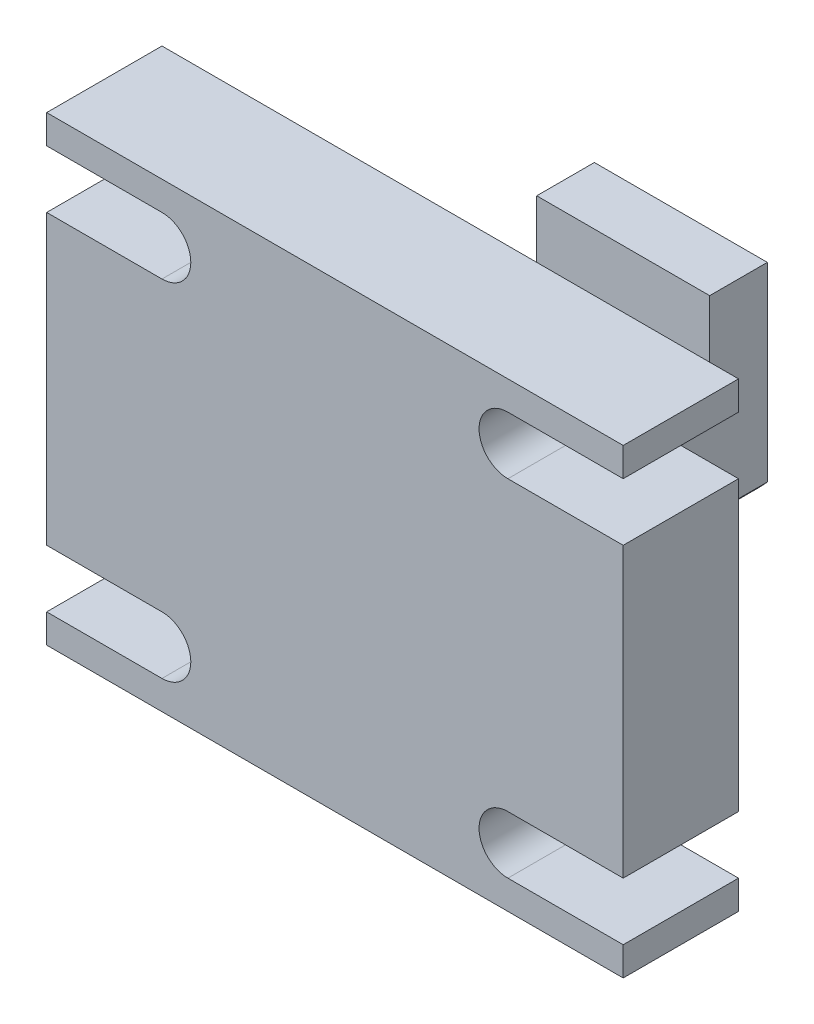
ISO-10303-21;
HEADER;
FILE_DESCRIPTION(('STEP AP214'),'2;1');
FILE_NAME('part.step','',(''),(''),'','','');
FILE_SCHEMA(('AUTOMOTIVE_DESIGN { 1 0 10303 214 1 1 1 1 }'));
ENDSEC;
DATA;
#1=APPLICATION_CONTEXT('core data for automotive mechanical design processes');
#2=APPLICATION_PROTOCOL_DEFINITION('international standard','automotive_design',2000,#1);
#3=PRODUCT_CONTEXT('',#1,'mechanical');
#4=PRODUCT('Part','Part','',(#3));
#5=PRODUCT_RELATED_PRODUCT_CATEGORY('part','',(#4));
#6=PRODUCT_DEFINITION_FORMATION('','',#4);
#7=PRODUCT_DEFINITION_CONTEXT('part definition',#1,'design');
#8=PRODUCT_DEFINITION('design','',#6,#7);
#9=PRODUCT_DEFINITION_SHAPE('','',#8);
#10=(LENGTH_UNIT() NAMED_UNIT(*) SI_UNIT(.MILLI.,.METRE.));
#11=(NAMED_UNIT(*) PLANE_ANGLE_UNIT() SI_UNIT($,.RADIAN.));
#12=(NAMED_UNIT(*) SI_UNIT($,.STERADIAN.) SOLID_ANGLE_UNIT());
#13=UNCERTAINTY_MEASURE_WITH_UNIT(LENGTH_MEASURE(1.E-05),#10,'distance_accuracy_value','');
#14=(GEOMETRIC_REPRESENTATION_CONTEXT(3) GLOBAL_UNCERTAINTY_ASSIGNED_CONTEXT((#13)) GLOBAL_UNIT_ASSIGNED_CONTEXT((#10,
#11,#12)) REPRESENTATION_CONTEXT('',''));
#15=CARTESIAN_POINT('',(0.,0.,0.));
#16=DIRECTION('',(0.,0.,1.));
#17=DIRECTION('',(1.,0.,0.));
#18=AXIS2_PLACEMENT_3D('',#15,#16,#17);
#19=CARTESIAN_POINT('',(0.,0.,0.));
#20=DIRECTION('',(0.,0.,1.));
#21=DIRECTION('',(1.,0.,0.));
#22=AXIS2_PLACEMENT_3D('',#19,#20,#21);
#23=PLANE('',#22);
#24=CARTESIAN_POINT('',(-30.,-30.,0.));
#25=DIRECTION('',(0.,0.,1.));
#26=DIRECTION('',(1.,0.,0.));
#27=AXIS2_PLACEMENT_3D('',#24,#25,#26);
#28=CIRCLE('',#27,5.);
#29=CARTESIAN_POINT('',(-30.,-35.,0.));
#30=VERTEX_POINT('',#29);
#31=CARTESIAN_POINT('',(-30.,-25.,0.));
#32=VERTEX_POINT('',#31);
#33=EDGE_CURVE('E213',#30,#32,#28,.T.);
#34=ORIENTED_EDGE('',*,*,#33,.T.);
#35=DIRECTION('',(1.,0.,0.));
#36=VECTOR('',#35,1.);
#37=CARTESIAN_POINT('',(0.,-25.,0.));
#38=LINE('',#37,#36);
#39=CARTESIAN_POINT('',(-50.,-25.,0.));
#40=VERTEX_POINT('',#39);
#41=EDGE_CURVE('E260',#40,#32,#38,.T.);
#42=ORIENTED_EDGE('',*,*,#41,.F.);
#43=DIRECTION('',(0.,-1.,0.));
#44=VECTOR('',#43,1.);
#45=CARTESIAN_POINT('',(-50.,0.,0.));
#46=LINE('',#45,#44);
#47=CARTESIAN_POINT('',(-50.,25.,0.));
#48=VERTEX_POINT('',#47);
#49=EDGE_CURVE('E223',#48,#40,#46,.T.);
#50=ORIENTED_EDGE('',*,*,#49,.F.);
#51=DIRECTION('',(1.,0.,0.));
#52=VECTOR('',#51,1.);
#53=CARTESIAN_POINT('',(0.,25.,0.));
#54=LINE('',#53,#52);
#55=CARTESIAN_POINT('',(-30.,25.,0.));
#56=VERTEX_POINT('',#55);
#57=EDGE_CURVE('E190',#48,#56,#54,.T.);
#58=ORIENTED_EDGE('',*,*,#57,.T.);
#59=CARTESIAN_POINT('',(-30.,30.,0.));
#60=DIRECTION('',(0.,0.,1.));
#61=DIRECTION('',(1.,0.,0.));
#62=AXIS2_PLACEMENT_3D('',#59,#60,#61);
#63=CIRCLE('',#62,5.);
#64=CARTESIAN_POINT('',(-30.,35.,0.));
#65=VERTEX_POINT('',#64);
#66=EDGE_CURVE('E256',#56,#65,#63,.T.);
#67=ORIENTED_EDGE('',*,*,#66,.T.);
#68=DIRECTION('',(1.,0.,0.));
#69=VECTOR('',#68,1.);
#70=CARTESIAN_POINT('',(0.,35.,0.));
#71=LINE('',#70,#69);
#72=CARTESIAN_POINT('',(-50.,35.,0.));
#73=VERTEX_POINT('',#72);
#74=EDGE_CURVE('E253',#73,#65,#71,.T.);
#75=ORIENTED_EDGE('',*,*,#74,.F.);
#76=CARTESIAN_POINT('',(-50.,40.,0.));
#77=VERTEX_POINT('',#76);
#78=EDGE_CURVE('E224',#77,#73,#46,.T.);
#79=ORIENTED_EDGE('',*,*,#78,.F.);
#80=DIRECTION('',(1.,0.,0.));
#81=VECTOR('',#80,1.);
#82=CARTESIAN_POINT('',(0.,40.,0.));
#83=LINE('',#82,#81);
#84=CARTESIAN_POINT('',(50.,40.,0.));
#85=VERTEX_POINT('',#84);
#86=EDGE_CURVE('E250',#77,#85,#83,.T.);
#87=ORIENTED_EDGE('',*,*,#86,.T.);
#88=DIRECTION('',(0.,-1.,0.));
#89=VECTOR('',#88,1.);
#90=CARTESIAN_POINT('',(50.,0.,0.));
#91=LINE('',#90,#89);
#92=CARTESIAN_POINT('',(50.,35.,0.));
#93=VERTEX_POINT('',#92);
#94=EDGE_CURVE('E231',#85,#93,#91,.T.);
#95=ORIENTED_EDGE('',*,*,#94,.T.);
#96=DIRECTION('',(-1.,0.,0.));
#97=VECTOR('',#96,1.);
#98=CARTESIAN_POINT('',(0.,35.,0.));
#99=LINE('',#98,#97);
#100=CARTESIAN_POINT('',(30.,35.,0.));
#101=VERTEX_POINT('',#100);
#102=EDGE_CURVE('E247',#93,#101,#99,.T.);
#103=ORIENTED_EDGE('',*,*,#102,.T.);
#104=CARTESIAN_POINT('',(30.,30.,0.));
#105=DIRECTION('',(0.,0.,1.));
#106=DIRECTION('',(1.,0.,0.));
#107=AXIS2_PLACEMENT_3D('',#104,#105,#106);
#108=CIRCLE('',#107,5.);
#109=CARTESIAN_POINT('',(30.,25.,0.));
#110=VERTEX_POINT('',#109);
#111=EDGE_CURVE('E244',#101,#110,#108,.T.);
#112=ORIENTED_EDGE('',*,*,#111,.T.);
#113=DIRECTION('',(-1.,0.,0.));
#114=VECTOR('',#113,1.);
#115=CARTESIAN_POINT('',(0.,25.,0.));
#116=LINE('',#115,#114);
#117=CARTESIAN_POINT('',(50.,25.,0.));
#118=VERTEX_POINT('',#117);
#119=EDGE_CURVE('E241',#118,#110,#116,.T.);
#120=ORIENTED_EDGE('',*,*,#119,.F.);
#121=CARTESIAN_POINT('',(50.,-25.,0.));
#122=VERTEX_POINT('',#121);
#123=EDGE_CURVE('E232',#118,#122,#91,.T.);
#124=ORIENTED_EDGE('',*,*,#123,.T.);
#125=DIRECTION('',(-1.,0.,0.));
#126=VECTOR('',#125,1.);
#127=CARTESIAN_POINT('',(0.,-25.,0.));
#128=LINE('',#127,#126);
#129=CARTESIAN_POINT('',(30.,-25.,0.));
#130=VERTEX_POINT('',#129);
#131=EDGE_CURVE('E238',#122,#130,#128,.T.);
#132=ORIENTED_EDGE('',*,*,#131,.T.);
#133=CARTESIAN_POINT('',(30.,-30.,0.));
#134=DIRECTION('',(0.,0.,1.));
#135=DIRECTION('',(1.,0.,0.));
#136=AXIS2_PLACEMENT_3D('',#133,#134,#135);
#137=CIRCLE('',#136,5.);
#138=CARTESIAN_POINT('',(30.,-35.,0.));
#139=VERTEX_POINT('',#138);
#140=EDGE_CURVE('E235',#130,#139,#137,.T.);
#141=ORIENTED_EDGE('',*,*,#140,.T.);
#142=DIRECTION('',(-1.,0.,0.));
#143=VECTOR('',#142,1.);
#144=CARTESIAN_POINT('',(0.,-35.,0.));
#145=LINE('',#144,#143);
#146=CARTESIAN_POINT('',(50.,-35.,0.));
#147=VERTEX_POINT('',#146);
#148=EDGE_CURVE('E230',#147,#139,#145,.T.);
#149=ORIENTED_EDGE('',*,*,#148,.F.);
#150=CARTESIAN_POINT('',(50.,-40.,0.));
#151=VERTEX_POINT('',#150);
#152=EDGE_CURVE('E227',#147,#151,#91,.T.);
#153=ORIENTED_EDGE('',*,*,#152,.T.);
#154=DIRECTION('',(1.,0.,0.));
#155=VECTOR('',#154,1.);
#156=CARTESIAN_POINT('',(0.,-40.,0.));
#157=LINE('',#156,#155);
#158=CARTESIAN_POINT('',(-50.,-40.,0.));
#159=VERTEX_POINT('',#158);
#160=EDGE_CURVE('E222',#159,#151,#157,.T.);
#161=ORIENTED_EDGE('',*,*,#160,.F.);
#162=CARTESIAN_POINT('',(-50.,-35.,0.));
#163=VERTEX_POINT('',#162);
#164=EDGE_CURVE('E220',#163,#159,#46,.T.);
#165=ORIENTED_EDGE('',*,*,#164,.F.);
#166=DIRECTION('',(1.,0.,0.));
#167=VECTOR('',#166,1.);
#168=CARTESIAN_POINT('',(0.,-35.,0.));
#169=LINE('',#168,#167);
#170=EDGE_CURVE('E216',#163,#30,#169,.T.);
#171=ORIENTED_EDGE('',*,*,#170,.T.);
#172=EDGE_LOOP('',(#34,#42,#50,#58,#67,#75,#79,#87,#95,#103,#112,#120,#124,#132,#141,#149,#153,
#161,#165,#171));
#173=FACE_BOUND('',#172,.T.);
#174=DIRECTION('',(-1.,0.,0.));
#175=VECTOR('',#174,1.);
#176=CARTESIAN_POINT('',(0.,5.,0.));
#177=LINE('',#176,#175);
#178=CARTESIAN_POINT('',(25.,5.,0.));
#179=VERTEX_POINT('',#178);
#180=CARTESIAN_POINT('',(-25.,5.,0.));
#181=VERTEX_POINT('',#180);
#182=EDGE_CURVE('E768',#179,#181,#177,.T.);
#183=ORIENTED_EDGE('',*,*,#182,.T.);
#184=DIRECTION('',(0.,-1.,0.));
#185=VECTOR('',#184,1.);
#186=CARTESIAN_POINT('',(-25.,5.,0.));
#187=LINE('',#186,#185);
#188=CARTESIAN_POINT('',(-25.,-5.,0.));
#189=VERTEX_POINT('',#188);
#190=EDGE_CURVE('E217',#181,#189,#187,.T.);
#191=ORIENTED_EDGE('',*,*,#190,.T.);
#192=DIRECTION('',(-1.,0.,0.));
#193=VECTOR('',#192,1.);
#194=CARTESIAN_POINT('',(0.,-5.,0.));
#195=LINE('',#194,#193);
#196=CARTESIAN_POINT('',(25.,-5.,0.));
#197=VERTEX_POINT('',#196);
#198=EDGE_CURVE('E756',#197,#189,#195,.T.);
#199=ORIENTED_EDGE('',*,*,#198,.F.);
#200=DIRECTION('',(0.,-1.,0.));
#201=VECTOR('',#200,1.);
#202=CARTESIAN_POINT('',(25.,5.,0.));
#203=LINE('',#202,#201);
#204=EDGE_CURVE('E786',#179,#197,#203,.T.);
#205=ORIENTED_EDGE('',*,*,#204,.F.);
#206=EDGE_LOOP('',(#183,#191,#199,#205));
#207=FACE_BOUND('',#206,.T.);
#208=ADVANCED_FACE('F33',(#173,#207),#23,.F.);
#209=CARTESIAN_POINT('',(-30.,-30.,20.));
#210=DIRECTION('',(0.,0.,-1.));
#211=DIRECTION('',(-1.,0.,0.));
#212=AXIS2_PLACEMENT_3D('',#209,#210,#211);
#213=CYLINDRICAL_SURFACE('',#212,5.);
#214=ORIENTED_EDGE('',*,*,#33,.F.);
#215=DIRECTION('',(0.,0.,-1.));
#216=VECTOR('',#215,1.);
#217=CARTESIAN_POINT('',(-30.,-35.,20.));
#218=LINE('',#217,#216);
#219=CARTESIAN_POINT('',(-30.,-35.,20.));
#220=VERTEX_POINT('',#219);
#221=EDGE_CURVE('E11',#220,#30,#218,.T.);
#222=ORIENTED_EDGE('',*,*,#221,.F.);
#223=CARTESIAN_POINT('',(-30.,-30.,20.));
#224=DIRECTION('',(0.,0.,1.));
#225=DIRECTION('',(1.,0.,0.));
#226=AXIS2_PLACEMENT_3D('',#223,#224,#225);
#227=CIRCLE('',#226,5.);
#228=CARTESIAN_POINT('',(-30.,-25.,20.));
#229=VERTEX_POINT('',#228);
#230=EDGE_CURVE('E262',#220,#229,#227,.T.);
#231=ORIENTED_EDGE('',*,*,#230,.T.);
#232=DIRECTION('',(0.,0.,-1.));
#233=VECTOR('',#232,1.);
#234=CARTESIAN_POINT('',(-30.,-25.,20.));
#235=LINE('',#234,#233);
#236=EDGE_CURVE('E125',#229,#32,#235,.T.);
#237=ORIENTED_EDGE('',*,*,#236,.T.);
#238=EDGE_LOOP('',(#214,#222,#231,#237));
#239=FACE_BOUND('',#238,.T.);
#240=ADVANCED_FACE('F35',(#239),#213,.F.);
#241=CARTESIAN_POINT('',(0.,-35.,20.));
#242=DIRECTION('',(0.,1.,0.));
#243=DIRECTION('',(0.,0.,1.));
#244=AXIS2_PLACEMENT_3D('',#241,#242,#243);
#245=PLANE('',#244);
#246=ORIENTED_EDGE('',*,*,#170,.F.);
#247=DIRECTION('',(0.,0.,-1.));
#248=VECTOR('',#247,1.);
#249=CARTESIAN_POINT('',(-50.,-35.,20.));
#250=LINE('',#249,#248);
#251=CARTESIAN_POINT('',(-50.,-35.,20.));
#252=VERTEX_POINT('',#251);
#253=EDGE_CURVE('E41',#252,#163,#250,.T.);
#254=ORIENTED_EDGE('',*,*,#253,.F.);
#255=DIRECTION('',(1.,0.,0.));
#256=VECTOR('',#255,1.);
#257=CARTESIAN_POINT('',(0.,-35.,20.));
#258=LINE('',#257,#256);
#259=EDGE_CURVE('E308',#252,#220,#258,.T.);
#260=ORIENTED_EDGE('',*,*,#259,.T.);
#261=ORIENTED_EDGE('',*,*,#221,.T.);
#262=EDGE_LOOP('',(#246,#254,#260,#261));
#263=FACE_BOUND('',#262,.T.);
#264=ADVANCED_FACE('F307',(#263),#245,.T.);
#265=CARTESIAN_POINT('',(-50.,0.,20.));
#266=DIRECTION('',(1.,0.,0.));
#267=DIRECTION('',(0.,1.,0.));
#268=AXIS2_PLACEMENT_3D('',#265,#266,#267);
#269=PLANE('',#268);
#270=ORIENTED_EDGE('',*,*,#164,.T.);
#271=DIRECTION('',(0.,0.,-1.));
#272=VECTOR('',#271,1.);
#273=CARTESIAN_POINT('',(-50.,-40.,20.));
#274=LINE('',#273,#272);
#275=CARTESIAN_POINT('',(-50.,-40.,20.));
#276=VERTEX_POINT('',#275);
#277=EDGE_CURVE('E293',#276,#159,#274,.T.);
#278=ORIENTED_EDGE('',*,*,#277,.F.);
#279=DIRECTION('',(0.,-1.,0.));
#280=VECTOR('',#279,1.);
#281=CARTESIAN_POINT('',(-50.,0.,20.));
#282=LINE('',#281,#280);
#283=EDGE_CURVE('E202',#252,#276,#282,.T.);
#284=ORIENTED_EDGE('',*,*,#283,.F.);
#285=ORIENTED_EDGE('',*,*,#253,.T.);
#286=EDGE_LOOP('',(#270,#278,#284,#285));
#287=FACE_BOUND('',#286,.T.);
#288=ADVANCED_FACE('F298',(#287),#269,.F.);
#289=CARTESIAN_POINT('',(0.,-40.,20.));
#290=DIRECTION('',(0.,1.,0.));
#291=DIRECTION('',(0.,0.,1.));
#292=AXIS2_PLACEMENT_3D('',#289,#290,#291);
#293=PLANE('',#292);
#294=ORIENTED_EDGE('',*,*,#160,.T.);
#295=DIRECTION('',(0.,0.,-1.));
#296=VECTOR('',#295,1.);
#297=CARTESIAN_POINT('',(50.,-40.,20.));
#298=LINE('',#297,#296);
#299=CARTESIAN_POINT('',(50.,-40.,20.));
#300=VERTEX_POINT('',#299);
#301=EDGE_CURVE('E291',#300,#151,#298,.T.);
#302=ORIENTED_EDGE('',*,*,#301,.F.);
#303=DIRECTION('',(1.,0.,0.));
#304=VECTOR('',#303,1.);
#305=CARTESIAN_POINT('',(0.,-40.,20.));
#306=LINE('',#305,#304);
#307=EDGE_CURVE('E318',#276,#300,#306,.T.);
#308=ORIENTED_EDGE('',*,*,#307,.F.);
#309=ORIENTED_EDGE('',*,*,#277,.T.);
#310=EDGE_LOOP('',(#294,#302,#308,#309));
#311=FACE_BOUND('',#310,.T.);
#312=ADVANCED_FACE('F394',(#311),#293,.F.);
#313=CARTESIAN_POINT('',(50.,0.,20.));
#314=DIRECTION('',(1.,0.,0.));
#315=DIRECTION('',(0.,1.,0.));
#316=AXIS2_PLACEMENT_3D('',#313,#314,#315);
#317=PLANE('',#316);
#318=ORIENTED_EDGE('',*,*,#152,.F.);
#319=DIRECTION('',(0.,0.,-1.));
#320=VECTOR('',#319,1.);
#321=CARTESIAN_POINT('',(50.,-35.,20.));
#322=LINE('',#321,#320);
#323=CARTESIAN_POINT('',(50.,-35.,20.));
#324=VERTEX_POINT('',#323);
#325=EDGE_CURVE('E289',#324,#147,#322,.T.);
#326=ORIENTED_EDGE('',*,*,#325,.F.);
#327=DIRECTION('',(0.,-1.,0.));
#328=VECTOR('',#327,1.);
#329=CARTESIAN_POINT('',(50.,0.,20.));
#330=LINE('',#329,#328);
#331=EDGE_CURVE('E320',#324,#300,#330,.T.);
#332=ORIENTED_EDGE('',*,*,#331,.T.);
#333=ORIENTED_EDGE('',*,*,#301,.T.);
#334=EDGE_LOOP('',(#318,#326,#332,#333));
#335=FACE_BOUND('',#334,.T.);
#336=ADVANCED_FACE('F388',(#335),#317,.T.);
#337=CARTESIAN_POINT('',(0.,-35.,20.));
#338=DIRECTION('',(0.,-1.,0.));
#339=DIRECTION('',(1.,0.,0.));
#340=AXIS2_PLACEMENT_3D('',#337,#338,#339);
#341=PLANE('',#340);
#342=ORIENTED_EDGE('',*,*,#148,.T.);
#343=DIRECTION('',(0.,0.,-1.));
#344=VECTOR('',#343,1.);
#345=CARTESIAN_POINT('',(30.,-35.,20.));
#346=LINE('',#345,#344);
#347=CARTESIAN_POINT('',(30.,-35.,20.));
#348=VERTEX_POINT('',#347);
#349=EDGE_CURVE('E287',#348,#139,#346,.T.);
#350=ORIENTED_EDGE('',*,*,#349,.F.);
#351=DIRECTION('',(-1.,0.,0.));
#352=VECTOR('',#351,1.);
#353=CARTESIAN_POINT('',(0.,-35.,20.));
#354=LINE('',#353,#352);
#355=EDGE_CURVE('E323',#324,#348,#354,.T.);
#356=ORIENTED_EDGE('',*,*,#355,.F.);
#357=ORIENTED_EDGE('',*,*,#325,.T.);
#358=EDGE_LOOP('',(#342,#350,#356,#357));
#359=FACE_BOUND('',#358,.T.);
#360=ADVANCED_FACE('F395',(#359),#341,.F.);
#361=CARTESIAN_POINT('',(30.,-30.,20.));
#362=DIRECTION('',(0.,0.,-1.));
#363=DIRECTION('',(-1.,0.,0.));
#364=AXIS2_PLACEMENT_3D('',#361,#362,#363);
#365=CYLINDRICAL_SURFACE('',#364,5.);
#366=ORIENTED_EDGE('',*,*,#140,.F.);
#367=DIRECTION('',(0.,0.,-1.));
#368=VECTOR('',#367,1.);
#369=CARTESIAN_POINT('',(30.,-25.,20.));
#370=LINE('',#369,#368);
#371=CARTESIAN_POINT('',(30.,-25.,20.));
#372=VERTEX_POINT('',#371);
#373=EDGE_CURVE('E285',#372,#130,#370,.T.);
#374=ORIENTED_EDGE('',*,*,#373,.F.);
#375=CARTESIAN_POINT('',(30.,-30.,20.));
#376=DIRECTION('',(0.,0.,1.));
#377=DIRECTION('',(1.,0.,0.));
#378=AXIS2_PLACEMENT_3D('',#375,#376,#377);
#379=CIRCLE('',#378,5.);
#380=EDGE_CURVE('E327',#372,#348,#379,.T.);
#381=ORIENTED_EDGE('',*,*,#380,.T.);
#382=ORIENTED_EDGE('',*,*,#349,.T.);
#383=EDGE_LOOP('',(#366,#374,#381,#382));
#384=FACE_BOUND('',#383,.T.);
#385=ADVANCED_FACE('F382',(#384),#365,.F.);
#386=CARTESIAN_POINT('',(0.,-25.,20.));
#387=DIRECTION('',(0.,-1.,0.));
#388=DIRECTION('',(1.,0.,0.));
#389=AXIS2_PLACEMENT_3D('',#386,#387,#388);
#390=PLANE('',#389);
#391=ORIENTED_EDGE('',*,*,#131,.F.);
#392=DIRECTION('',(0.,0.,-1.));
#393=VECTOR('',#392,1.);
#394=CARTESIAN_POINT('',(50.,-25.,20.));
#395=LINE('',#394,#393);
#396=CARTESIAN_POINT('',(50.,-25.,20.));
#397=VERTEX_POINT('',#396);
#398=EDGE_CURVE('E283',#397,#122,#395,.T.);
#399=ORIENTED_EDGE('',*,*,#398,.F.);
#400=DIRECTION('',(-1.,0.,0.));
#401=VECTOR('',#400,1.);
#402=CARTESIAN_POINT('',(0.,-25.,20.));
#403=LINE('',#402,#401);
#404=EDGE_CURVE('E330',#397,#372,#403,.T.);
#405=ORIENTED_EDGE('',*,*,#404,.T.);
#406=ORIENTED_EDGE('',*,*,#373,.T.);
#407=EDGE_LOOP('',(#391,#399,#405,#406));
#408=FACE_BOUND('',#407,.T.);
#409=ADVANCED_FACE('F378',(#408),#390,.T.);
#410=ORIENTED_EDGE('',*,*,#123,.F.);
#411=DIRECTION('',(0.,0.,-1.));
#412=VECTOR('',#411,1.);
#413=CARTESIAN_POINT('',(50.,25.,20.));
#414=LINE('',#413,#412);
#415=CARTESIAN_POINT('',(50.,25.,20.));
#416=VERTEX_POINT('',#415);
#417=EDGE_CURVE('E281',#416,#118,#414,.T.);
#418=ORIENTED_EDGE('',*,*,#417,.F.);
#419=EDGE_CURVE('E325',#416,#397,#330,.T.);
#420=ORIENTED_EDGE('',*,*,#419,.T.);
#421=ORIENTED_EDGE('',*,*,#398,.T.);
#422=EDGE_LOOP('',(#410,#418,#420,#421));
#423=FACE_BOUND('',#422,.T.);
#424=ADVANCED_FACE('F372',(#423),#317,.T.);
#425=CARTESIAN_POINT('',(0.,25.,20.));
#426=DIRECTION('',(0.,-1.,0.));
#427=DIRECTION('',(1.,0.,0.));
#428=AXIS2_PLACEMENT_3D('',#425,#426,#427);
#429=PLANE('',#428);
#430=ORIENTED_EDGE('',*,*,#119,.T.);
#431=DIRECTION('',(0.,0.,-1.));
#432=VECTOR('',#431,1.);
#433=CARTESIAN_POINT('',(30.,25.,20.));
#434=LINE('',#433,#432);
#435=CARTESIAN_POINT('',(30.,25.,20.));
#436=VERTEX_POINT('',#435);
#437=EDGE_CURVE('E279',#436,#110,#434,.T.);
#438=ORIENTED_EDGE('',*,*,#437,.F.);
#439=DIRECTION('',(-1.,0.,0.));
#440=VECTOR('',#439,1.);
#441=CARTESIAN_POINT('',(0.,25.,20.));
#442=LINE('',#441,#440);
#443=EDGE_CURVE('E333',#416,#436,#442,.T.);
#444=ORIENTED_EDGE('',*,*,#443,.F.);
#445=ORIENTED_EDGE('',*,*,#417,.T.);
#446=EDGE_LOOP('',(#430,#438,#444,#445));
#447=FACE_BOUND('',#446,.T.);
#448=ADVANCED_FACE('F433',(#447),#429,.F.);
#449=CARTESIAN_POINT('',(30.,30.,20.));
#450=DIRECTION('',(0.,0.,-1.));
#451=DIRECTION('',(-1.,0.,0.));
#452=AXIS2_PLACEMENT_3D('',#449,#450,#451);
#453=CYLINDRICAL_SURFACE('',#452,5.);
#454=ORIENTED_EDGE('',*,*,#111,.F.);
#455=DIRECTION('',(0.,0.,-1.));
#456=VECTOR('',#455,1.);
#457=CARTESIAN_POINT('',(30.,35.,20.));
#458=LINE('',#457,#456);
#459=CARTESIAN_POINT('',(30.,35.,20.));
#460=VERTEX_POINT('',#459);
#461=EDGE_CURVE('E277',#460,#101,#458,.T.);
#462=ORIENTED_EDGE('',*,*,#461,.F.);
#463=CARTESIAN_POINT('',(30.,30.,20.));
#464=DIRECTION('',(0.,0.,1.));
#465=DIRECTION('',(1.,0.,0.));
#466=AXIS2_PLACEMENT_3D('',#463,#464,#465);
#467=CIRCLE('',#466,5.);
#468=EDGE_CURVE('E335',#460,#436,#467,.T.);
#469=ORIENTED_EDGE('',*,*,#468,.T.);
#470=ORIENTED_EDGE('',*,*,#437,.T.);
#471=EDGE_LOOP('',(#454,#462,#469,#470));
#472=FACE_BOUND('',#471,.T.);
#473=ADVANCED_FACE('F429',(#472),#453,.F.);
#474=CARTESIAN_POINT('',(0.,35.,20.));
#475=DIRECTION('',(0.,-1.,0.));
#476=DIRECTION('',(1.,0.,0.));
#477=AXIS2_PLACEMENT_3D('',#474,#475,#476);
#478=PLANE('',#477);
#479=ORIENTED_EDGE('',*,*,#102,.F.);
#480=DIRECTION('',(0.,0.,-1.));
#481=VECTOR('',#480,1.);
#482=CARTESIAN_POINT('',(50.,35.,20.));
#483=LINE('',#482,#481);
#484=CARTESIAN_POINT('',(50.,35.,20.));
#485=VERTEX_POINT('',#484);
#486=EDGE_CURVE('E275',#485,#93,#483,.T.);
#487=ORIENTED_EDGE('',*,*,#486,.F.);
#488=DIRECTION('',(-1.,0.,0.));
#489=VECTOR('',#488,1.);
#490=CARTESIAN_POINT('',(0.,35.,20.));
#491=LINE('',#490,#489);
#492=EDGE_CURVE('E338',#485,#460,#491,.T.);
#493=ORIENTED_EDGE('',*,*,#492,.T.);
#494=ORIENTED_EDGE('',*,*,#461,.T.);
#495=EDGE_LOOP('',(#479,#487,#493,#494));
#496=FACE_BOUND('',#495,.T.);
#497=ADVANCED_FACE('F426',(#496),#478,.T.);
#498=ORIENTED_EDGE('',*,*,#94,.F.);
#499=DIRECTION('',(0.,0.,-1.));
#500=VECTOR('',#499,1.);
#501=CARTESIAN_POINT('',(50.,40.,20.));
#502=LINE('',#501,#500);
#503=CARTESIAN_POINT('',(50.,40.,20.));
#504=VERTEX_POINT('',#503);
#505=EDGE_CURVE('E273',#504,#85,#502,.T.);
#506=ORIENTED_EDGE('',*,*,#505,.F.);
#507=EDGE_CURVE('E324',#504,#485,#330,.T.);
#508=ORIENTED_EDGE('',*,*,#507,.T.);
#509=ORIENTED_EDGE('',*,*,#486,.T.);
#510=EDGE_LOOP('',(#498,#506,#508,#509));
#511=FACE_BOUND('',#510,.T.);
#512=ADVANCED_FACE('F365',(#511),#317,.T.);
#513=CARTESIAN_POINT('',(0.,40.,20.));
#514=DIRECTION('',(0.,1.,0.));
#515=DIRECTION('',(0.,0.,1.));
#516=AXIS2_PLACEMENT_3D('',#513,#514,#515);
#517=PLANE('',#516);
#518=ORIENTED_EDGE('',*,*,#86,.F.);
#519=DIRECTION('',(0.,0.,-1.));
#520=VECTOR('',#519,1.);
#521=CARTESIAN_POINT('',(-50.,40.,20.));
#522=LINE('',#521,#520);
#523=CARTESIAN_POINT('',(-50.,40.,20.));
#524=VERTEX_POINT('',#523);
#525=EDGE_CURVE('E271',#524,#77,#522,.T.);
#526=ORIENTED_EDGE('',*,*,#525,.F.);
#527=DIRECTION('',(1.,0.,0.));
#528=VECTOR('',#527,1.);
#529=CARTESIAN_POINT('',(0.,40.,20.));
#530=LINE('',#529,#528);
#531=EDGE_CURVE('E341',#524,#504,#530,.T.);
#532=ORIENTED_EDGE('',*,*,#531,.T.);
#533=ORIENTED_EDGE('',*,*,#505,.T.);
#534=EDGE_LOOP('',(#518,#526,#532,#533));
#535=FACE_BOUND('',#534,.T.);
#536=ADVANCED_FACE('F361',(#535),#517,.T.);
#537=ORIENTED_EDGE('',*,*,#78,.T.);
#538=DIRECTION('',(0.,0.,-1.));
#539=VECTOR('',#538,1.);
#540=CARTESIAN_POINT('',(-50.,35.,20.));
#541=LINE('',#540,#539);
#542=CARTESIAN_POINT('',(-50.,35.,20.));
#543=VERTEX_POINT('',#542);
#544=EDGE_CURVE('E268',#543,#73,#541,.T.);
#545=ORIENTED_EDGE('',*,*,#544,.F.);
#546=EDGE_CURVE('E201',#524,#543,#282,.T.);
#547=ORIENTED_EDGE('',*,*,#546,.F.);
#548=ORIENTED_EDGE('',*,*,#525,.T.);
#549=EDGE_LOOP('',(#537,#545,#547,#548));
#550=FACE_BOUND('',#549,.T.);
#551=ADVANCED_FACE('F350',(#550),#269,.F.);
#552=CARTESIAN_POINT('',(0.,35.,20.));
#553=DIRECTION('',(0.,1.,0.));
#554=DIRECTION('',(0.,0.,1.));
#555=AXIS2_PLACEMENT_3D('',#552,#553,#554);
#556=PLANE('',#555);
#557=ORIENTED_EDGE('',*,*,#74,.T.);
#558=DIRECTION('',(0.,0.,-1.));
#559=VECTOR('',#558,1.);
#560=CARTESIAN_POINT('',(-30.,35.,20.));
#561=LINE('',#560,#559);
#562=CARTESIAN_POINT('',(-30.,35.,20.));
#563=VERTEX_POINT('',#562);
#564=EDGE_CURVE('E266',#563,#65,#561,.T.);
#565=ORIENTED_EDGE('',*,*,#564,.F.);
#566=DIRECTION('',(1.,0.,0.));
#567=VECTOR('',#566,1.);
#568=CARTESIAN_POINT('',(0.,35.,20.));
#569=LINE('',#568,#567);
#570=EDGE_CURVE('E208',#543,#563,#569,.T.);
#571=ORIENTED_EDGE('',*,*,#570,.F.);
#572=ORIENTED_EDGE('',*,*,#544,.T.);
#573=EDGE_LOOP('',(#557,#565,#571,#572));
#574=FACE_BOUND('',#573,.T.);
#575=ADVANCED_FACE('F354',(#574),#556,.F.);
#576=CARTESIAN_POINT('',(-30.,30.,20.));
#577=DIRECTION('',(0.,0.,-1.));
#578=DIRECTION('',(-1.,0.,0.));
#579=AXIS2_PLACEMENT_3D('',#576,#577,#578);
#580=CYLINDRICAL_SURFACE('',#579,5.);
#581=ORIENTED_EDGE('',*,*,#66,.F.);
#582=DIRECTION('',(0.,0.,-1.));
#583=VECTOR('',#582,1.);
#584=CARTESIAN_POINT('',(-30.,25.,20.));
#585=LINE('',#584,#583);
#586=CARTESIAN_POINT('',(-30.,25.,20.));
#587=VERTEX_POINT('',#586);
#588=EDGE_CURVE('E193',#587,#56,#585,.T.);
#589=ORIENTED_EDGE('',*,*,#588,.F.);
#590=CARTESIAN_POINT('',(-30.,30.,20.));
#591=DIRECTION('',(0.,0.,1.));
#592=DIRECTION('',(1.,0.,0.));
#593=AXIS2_PLACEMENT_3D('',#590,#591,#592);
#594=CIRCLE('',#593,5.);
#595=EDGE_CURVE('E206',#587,#563,#594,.T.);
#596=ORIENTED_EDGE('',*,*,#595,.T.);
#597=ORIENTED_EDGE('',*,*,#564,.T.);
#598=EDGE_LOOP('',(#581,#589,#596,#597));
#599=FACE_BOUND('',#598,.T.);
#600=ADVANCED_FACE('F357',(#599),#580,.F.);
#601=CARTESIAN_POINT('',(0.,25.,20.));
#602=DIRECTION('',(0.,1.,0.));
#603=DIRECTION('',(0.,0.,1.));
#604=AXIS2_PLACEMENT_3D('',#601,#602,#603);
#605=PLANE('',#604);
#606=ORIENTED_EDGE('',*,*,#57,.F.);
#607=DIRECTION('',(0.,0.,-1.));
#608=VECTOR('',#607,1.);
#609=CARTESIAN_POINT('',(-50.,25.,20.));
#610=LINE('',#609,#608);
#611=CARTESIAN_POINT('',(-50.,25.,20.));
#612=VERTEX_POINT('',#611);
#613=EDGE_CURVE('E184',#612,#48,#610,.T.);
#614=ORIENTED_EDGE('',*,*,#613,.F.);
#615=DIRECTION('',(1.,0.,0.));
#616=VECTOR('',#615,1.);
#617=CARTESIAN_POINT('',(0.,25.,20.));
#618=LINE('',#617,#616);
#619=EDGE_CURVE('E188',#612,#587,#618,.T.);
#620=ORIENTED_EDGE('',*,*,#619,.T.);
#621=ORIENTED_EDGE('',*,*,#588,.T.);
#622=EDGE_LOOP('',(#606,#614,#620,#621));
#623=FACE_BOUND('',#622,.T.);
#624=ADVANCED_FACE('F186',(#623),#605,.T.);
#625=ORIENTED_EDGE('',*,*,#49,.T.);
#626=DIRECTION('',(0.,0.,-1.));
#627=VECTOR('',#626,1.);
#628=CARTESIAN_POINT('',(-50.,-25.,20.));
#629=LINE('',#628,#627);
#630=CARTESIAN_POINT('',(-50.,-25.,20.));
#631=VERTEX_POINT('',#630);
#632=EDGE_CURVE('E194',#631,#40,#629,.T.);
#633=ORIENTED_EDGE('',*,*,#632,.F.);
#634=EDGE_CURVE('E197',#612,#631,#282,.T.);
#635=ORIENTED_EDGE('',*,*,#634,.F.);
#636=ORIENTED_EDGE('',*,*,#613,.T.);
#637=EDGE_LOOP('',(#625,#633,#635,#636));
#638=FACE_BOUND('',#637,.T.);
#639=ADVANCED_FACE('F198',(#638),#269,.F.);
#640=CARTESIAN_POINT('',(0.,-25.,20.));
#641=DIRECTION('',(0.,1.,0.));
#642=DIRECTION('',(0.,0.,1.));
#643=AXIS2_PLACEMENT_3D('',#640,#641,#642);
#644=PLANE('',#643);
#645=ORIENTED_EDGE('',*,*,#41,.T.);
#646=ORIENTED_EDGE('',*,*,#236,.F.);
#647=DIRECTION('',(1.,0.,0.));
#648=VECTOR('',#647,1.);
#649=CARTESIAN_POINT('',(0.,-25.,20.));
#650=LINE('',#649,#648);
#651=EDGE_CURVE('E57',#631,#229,#650,.T.);
#652=ORIENTED_EDGE('',*,*,#651,.F.);
#653=ORIENTED_EDGE('',*,*,#632,.T.);
#654=EDGE_LOOP('',(#645,#646,#652,#653));
#655=FACE_BOUND('',#654,.T.);
#656=ADVANCED_FACE('F311',(#655),#644,.F.);
#657=CARTESIAN_POINT('',(0.,0.,20.));
#658=DIRECTION('',(0.,0.,1.));
#659=DIRECTION('',(1.,0.,0.));
#660=AXIS2_PLACEMENT_3D('',#657,#658,#659);
#661=PLANE('',#660);
#662=ORIENTED_EDGE('',*,*,#230,.F.);
#663=ORIENTED_EDGE('',*,*,#259,.F.);
#664=ORIENTED_EDGE('',*,*,#283,.T.);
#665=ORIENTED_EDGE('',*,*,#307,.T.);
#666=ORIENTED_EDGE('',*,*,#331,.F.);
#667=ORIENTED_EDGE('',*,*,#355,.T.);
#668=ORIENTED_EDGE('',*,*,#380,.F.);
#669=ORIENTED_EDGE('',*,*,#404,.F.);
#670=ORIENTED_EDGE('',*,*,#419,.F.);
#671=ORIENTED_EDGE('',*,*,#443,.T.);
#672=ORIENTED_EDGE('',*,*,#468,.F.);
#673=ORIENTED_EDGE('',*,*,#492,.F.);
#674=ORIENTED_EDGE('',*,*,#507,.F.);
#675=ORIENTED_EDGE('',*,*,#531,.F.);
#676=ORIENTED_EDGE('',*,*,#546,.T.);
#677=ORIENTED_EDGE('',*,*,#570,.T.);
#678=ORIENTED_EDGE('',*,*,#595,.F.);
#679=ORIENTED_EDGE('',*,*,#619,.F.);
#680=ORIENTED_EDGE('',*,*,#634,.T.);
#681=ORIENTED_EDGE('',*,*,#651,.T.);
#682=EDGE_LOOP('',(#662,#663,#664,#665,#666,#667,#668,#669,#670,#671,#672,#673,#674,#675,#676,
#677,#678,#679,#680,#681));
#683=FACE_BOUND('',#682,.T.);
#684=ADVANCED_FACE('F204',(#683),#661,.T.);
#685=CARTESIAN_POINT('',(-25.,5.,-10.));
#686=DIRECTION('',(0.,-1.,0.));
#687=DIRECTION('',(0.,0.,-1.));
#688=AXIS2_PLACEMENT_3D('',#685,#686,#687);
#689=CYLINDRICAL_SURFACE('',#688,10.);
#690=CARTESIAN_POINT('',(-25.,-5.,-10.));
#691=DIRECTION('',(0.,-1.,0.));
#692=DIRECTION('',(0.,0.,-1.));
#693=AXIS2_PLACEMENT_3D('',#690,#691,#692);
#694=CIRCLE('',#693,10.);
#695=CARTESIAN_POINT('',(-15.,-5.,-10.));
#696=VERTEX_POINT('',#695);
#697=EDGE_CURVE('E751',#696,#189,#694,.T.);
#698=ORIENTED_EDGE('',*,*,#697,.T.);
#699=ORIENTED_EDGE('',*,*,#190,.F.);
#700=CARTESIAN_POINT('',(-25.,5.,-10.));
#701=DIRECTION('',(0.,-1.,0.));
#702=DIRECTION('',(0.,0.,-1.));
#703=AXIS2_PLACEMENT_3D('',#700,#701,#702);
#704=CIRCLE('',#703,10.);
#705=CARTESIAN_POINT('',(-15.,5.,-10.));
#706=VERTEX_POINT('',#705);
#707=EDGE_CURVE('E752',#706,#181,#704,.T.);
#708=ORIENTED_EDGE('',*,*,#707,.F.);
#709=DIRECTION('',(0.,-1.,0.));
#710=VECTOR('',#709,1.);
#711=CARTESIAN_POINT('',(-15.,5.,-10.));
#712=LINE('',#711,#710);
#713=EDGE_CURVE('E315',#706,#696,#712,.T.);
#714=ORIENTED_EDGE('',*,*,#713,.T.);
#715=EDGE_LOOP('',(#698,#699,#708,#714));
#716=FACE_BOUND('',#715,.T.);
#717=ADVANCED_FACE('F495',(#716),#689,.F.);
#718=CARTESIAN_POINT('',(25.,5.,-10.));
#719=DIRECTION('',(0.,-1.,0.));
#720=DIRECTION('',(0.,0.,-1.));
#721=AXIS2_PLACEMENT_3D('',#718,#719,#720);
#722=CYLINDRICAL_SURFACE('',#721,10.);
#723=CARTESIAN_POINT('',(25.,-5.,-10.));
#724=DIRECTION('',(0.,-1.,0.));
#725=DIRECTION('',(0.,0.,-1.));
#726=AXIS2_PLACEMENT_3D('',#723,#724,#725);
#727=CIRCLE('',#726,10.);
#728=CARTESIAN_POINT('',(15.,-5.,-10.));
#729=VERTEX_POINT('',#728);
#730=EDGE_CURVE('E48',#197,#729,#727,.T.);
#731=ORIENTED_EDGE('',*,*,#730,.T.);
#732=DIRECTION('',(0.,-1.,0.));
#733=VECTOR('',#732,1.);
#734=CARTESIAN_POINT('',(15.,5.,-10.));
#735=LINE('',#734,#733);
#736=CARTESIAN_POINT('',(15.,5.,-10.));
#737=VERTEX_POINT('',#736);
#738=EDGE_CURVE('E787',#737,#729,#735,.T.);
#739=ORIENTED_EDGE('',*,*,#738,.F.);
#740=CARTESIAN_POINT('',(25.,5.,-10.));
#741=DIRECTION('',(0.,-1.,0.));
#742=DIRECTION('',(0.,0.,-1.));
#743=AXIS2_PLACEMENT_3D('',#740,#741,#742);
#744=CIRCLE('',#743,10.);
#745=EDGE_CURVE('E765',#179,#737,#744,.T.);
#746=ORIENTED_EDGE('',*,*,#745,.F.);
#747=ORIENTED_EDGE('',*,*,#204,.T.);
#748=EDGE_LOOP('',(#731,#739,#746,#747));
#749=FACE_BOUND('',#748,.T.);
#750=ADVANCED_FACE('F501',(#749),#722,.F.);
#751=CARTESIAN_POINT('',(15.,5.,0.));
#752=DIRECTION('',(-1.,0.,0.));
#753=DIRECTION('',(0.,0.,1.));
#754=AXIS2_PLACEMENT_3D('',#751,#752,#753);
#755=PLANE('',#754);
#756=DIRECTION('',(0.,0.,-1.));
#757=VECTOR('',#756,1.);
#758=CARTESIAN_POINT('',(15.,-5.,0.));
#759=LINE('',#758,#757);
#760=CARTESIAN_POINT('',(15.,-5.,-30.));
#761=VERTEX_POINT('',#760);
#762=EDGE_CURVE('E779',#729,#761,#759,.T.);
#763=ORIENTED_EDGE('',*,*,#762,.T.);
#764=DIRECTION('',(0.,-1.,0.));
#765=VECTOR('',#764,1.);
#766=CARTESIAN_POINT('',(15.,20.,-30.));
#767=LINE('',#766,#765);
#768=CARTESIAN_POINT('',(15.,-13.,-30.));
#769=VERTEX_POINT('',#768);
#770=EDGE_CURVE('E711',#761,#769,#767,.T.);
#771=ORIENTED_EDGE('',*,*,#770,.T.);
#772=DIRECTION('',(0.,0.,1.));
#773=VECTOR('',#772,1.);
#774=CARTESIAN_POINT('',(15.,-13.,-40.));
#775=LINE('',#774,#773);
#776=CARTESIAN_POINT('',(15.,-13.,-40.));
#777=VERTEX_POINT('',#776);
#778=EDGE_CURVE('E748',#777,#769,#775,.T.);
#779=ORIENTED_EDGE('',*,*,#778,.F.);
#780=DIRECTION('',(0.,-1.,0.));
#781=VECTOR('',#780,1.);
#782=CARTESIAN_POINT('',(15.,20.,-40.));
#783=LINE('',#782,#781);
#784=CARTESIAN_POINT('',(15.,20.,-40.));
#785=VERTEX_POINT('',#784);
#786=EDGE_CURVE('E714',#785,#777,#783,.T.);
#787=ORIENTED_EDGE('',*,*,#786,.F.);
#788=DIRECTION('',(0.,0.,1.));
#789=VECTOR('',#788,1.);
#790=CARTESIAN_POINT('',(15.,20.,-40.));
#791=LINE('',#790,#789);
#792=CARTESIAN_POINT('',(15.,20.,-30.));
#793=VERTEX_POINT('',#792);
#794=EDGE_CURVE('E727',#785,#793,#791,.T.);
#795=ORIENTED_EDGE('',*,*,#794,.T.);
#796=CARTESIAN_POINT('',(15.,5.,-30.));
#797=VERTEX_POINT('',#796);
#798=EDGE_CURVE('E728',#793,#797,#767,.T.);
#799=ORIENTED_EDGE('',*,*,#798,.T.);
#800=DIRECTION('',(0.,0.,-1.));
#801=VECTOR('',#800,1.);
#802=CARTESIAN_POINT('',(15.,5.,0.));
#803=LINE('',#802,#801);
#804=EDGE_CURVE('E762',#737,#797,#803,.T.);
#805=ORIENTED_EDGE('',*,*,#804,.F.);
#806=ORIENTED_EDGE('',*,*,#738,.T.);
#807=EDGE_LOOP('',(#763,#771,#779,#787,#795,#799,#805,#806));
#808=FACE_BOUND('',#807,.T.);
#809=ADVANCED_FACE('F508',(#808),#755,.F.);
#810=CARTESIAN_POINT('',(-15.,5.,0.));
#811=DIRECTION('',(-1.,0.,0.));
#812=DIRECTION('',(0.,0.,1.));
#813=AXIS2_PLACEMENT_3D('',#810,#811,#812);
#814=PLANE('',#813);
#815=DIRECTION('',(0.,0.,-1.));
#816=VECTOR('',#815,1.);
#817=CARTESIAN_POINT('',(-15.,-5.,0.));
#818=LINE('',#817,#816);
#819=CARTESIAN_POINT('',(-15.,-5.,-30.));
#820=VERTEX_POINT('',#819);
#821=EDGE_CURVE('E773',#696,#820,#818,.T.);
#822=ORIENTED_EDGE('',*,*,#821,.F.);
#823=ORIENTED_EDGE('',*,*,#713,.F.);
#824=DIRECTION('',(0.,0.,-1.));
#825=VECTOR('',#824,1.);
#826=CARTESIAN_POINT('',(-15.,5.,0.));
#827=LINE('',#826,#825);
#828=CARTESIAN_POINT('',(-15.,5.,-30.));
#829=VERTEX_POINT('',#828);
#830=EDGE_CURVE('E755',#706,#829,#827,.T.);
#831=ORIENTED_EDGE('',*,*,#830,.T.);
#832=DIRECTION('',(0.,1.,0.));
#833=VECTOR('',#832,1.);
#834=CARTESIAN_POINT('',(-15.,20.,-30.));
#835=LINE('',#834,#833);
#836=CARTESIAN_POINT('',(-15.,20.,-30.));
#837=VERTEX_POINT('',#836);
#838=EDGE_CURVE('E734',#829,#837,#835,.T.);
#839=ORIENTED_EDGE('',*,*,#838,.T.);
#840=DIRECTION('',(0.,0.,1.));
#841=VECTOR('',#840,1.);
#842=CARTESIAN_POINT('',(-15.,20.,-40.));
#843=LINE('',#842,#841);
#844=CARTESIAN_POINT('',(-15.,20.,-40.));
#845=VERTEX_POINT('',#844);
#846=EDGE_CURVE('E742',#845,#837,#843,.T.);
#847=ORIENTED_EDGE('',*,*,#846,.F.);
#848=DIRECTION('',(0.,1.,0.));
#849=VECTOR('',#848,1.);
#850=CARTESIAN_POINT('',(-15.,20.,-40.));
#851=LINE('',#850,#849);
#852=CARTESIAN_POINT('',(-15.,-13.,-40.));
#853=VERTEX_POINT('',#852);
#854=EDGE_CURVE('E721',#853,#845,#851,.T.);
#855=ORIENTED_EDGE('',*,*,#854,.F.);
#856=DIRECTION('',(0.,0.,1.));
#857=VECTOR('',#856,1.);
#858=CARTESIAN_POINT('',(-15.,-13.,-40.));
#859=LINE('',#858,#857);
#860=CARTESIAN_POINT('',(-15.,-13.,-30.));
#861=VERTEX_POINT('',#860);
#862=EDGE_CURVE('E745',#853,#861,#859,.T.);
#863=ORIENTED_EDGE('',*,*,#862,.T.);
#864=EDGE_CURVE('E735',#861,#820,#835,.T.);
#865=ORIENTED_EDGE('',*,*,#864,.T.);
#866=EDGE_LOOP('',(#822,#823,#831,#839,#847,#855,#863,#865));
#867=FACE_BOUND('',#866,.T.);
#868=ADVANCED_FACE('F516',(#867),#814,.T.);
#869=CARTESIAN_POINT('',(0.,5.,0.));
#870=DIRECTION('',(0.,-1.,0.));
#871=DIRECTION('',(0.,0.,-1.));
#872=AXIS2_PLACEMENT_3D('',#869,#870,#871);
#873=PLANE('',#872);
#874=ORIENTED_EDGE('',*,*,#707,.T.);
#875=ORIENTED_EDGE('',*,*,#182,.F.);
#876=ORIENTED_EDGE('',*,*,#745,.T.);
#877=ORIENTED_EDGE('',*,*,#804,.T.);
#878=DIRECTION('',(1.,0.,0.));
#879=VECTOR('',#878,1.);
#880=CARTESIAN_POINT('',(0.,5.,-30.));
#881=LINE('',#880,#879);
#882=EDGE_CURVE('E759',#829,#797,#881,.T.);
#883=ORIENTED_EDGE('',*,*,#882,.F.);
#884=ORIENTED_EDGE('',*,*,#830,.F.);
#885=EDGE_LOOP('',(#874,#875,#876,#877,#883,#884));
#886=FACE_BOUND('',#885,.T.);
#887=ADVANCED_FACE('F524',(#886),#873,.F.);
#888=CARTESIAN_POINT('',(0.,-5.,0.));
#889=DIRECTION('',(0.,-1.,0.));
#890=DIRECTION('',(0.,0.,-1.));
#891=AXIS2_PLACEMENT_3D('',#888,#889,#890);
#892=PLANE('',#891);
#893=ORIENTED_EDGE('',*,*,#697,.F.);
#894=ORIENTED_EDGE('',*,*,#821,.T.);
#895=DIRECTION('',(1.,0.,0.));
#896=VECTOR('',#895,1.);
#897=CARTESIAN_POINT('',(0.,-5.,-30.));
#898=LINE('',#897,#896);
#899=EDGE_CURVE('E776',#820,#761,#898,.T.);
#900=ORIENTED_EDGE('',*,*,#899,.T.);
#901=ORIENTED_EDGE('',*,*,#762,.F.);
#902=ORIENTED_EDGE('',*,*,#730,.F.);
#903=ORIENTED_EDGE('',*,*,#198,.T.);
#904=EDGE_LOOP('',(#893,#894,#900,#901,#902,#903));
#905=FACE_BOUND('',#904,.T.);
#906=ADVANCED_FACE('F532',(#905),#892,.T.);
#907=CARTESIAN_POINT('',(0.,-0.428571428571433,-30.));
#908=DIRECTION('',(0.,0.,-1.));
#909=DIRECTION('',(-1.,0.,0.));
#910=AXIS2_PLACEMENT_3D('',#907,#908,#909);
#911=PLANE('',#910);
#912=ORIENTED_EDGE('',*,*,#838,.F.);
#913=ORIENTED_EDGE('',*,*,#882,.T.);
#914=ORIENTED_EDGE('',*,*,#798,.F.);
#915=DIRECTION('',(1.,0.,0.));
#916=VECTOR('',#915,1.);
#917=CARTESIAN_POINT('',(15.,20.,-30.));
#918=LINE('',#917,#916);
#919=EDGE_CURVE('E718',#837,#793,#918,.T.);
#920=ORIENTED_EDGE('',*,*,#919,.F.);
#921=EDGE_LOOP('',(#912,#913,#914,#920));
#922=FACE_BOUND('',#921,.T.);
#923=ADVANCED_FACE('F540',(#922),#911,.F.);
#924=CARTESIAN_POINT('',(0.,-0.428571428571433,-40.));
#925=DIRECTION('',(0.,0.,-1.));
#926=DIRECTION('',(-1.,0.,0.));
#927=AXIS2_PLACEMENT_3D('',#924,#925,#926);
#928=PLANE('',#927);
#929=ORIENTED_EDGE('',*,*,#786,.T.);
#930=CARTESIAN_POINT('',(0.,-0.428571428571433,-40.));
#931=DIRECTION('',(0.,0.,-1.));
#932=DIRECTION('',(-1.,0.,0.));
#933=AXIS2_PLACEMENT_3D('',#930,#931,#932);
#934=CIRCLE('',#933,19.5714285714286);
#935=EDGE_CURVE('E717',#777,#853,#934,.T.);
#936=ORIENTED_EDGE('',*,*,#935,.T.);
#937=ORIENTED_EDGE('',*,*,#854,.T.);
#938=DIRECTION('',(1.,0.,0.));
#939=VECTOR('',#938,1.);
#940=CARTESIAN_POINT('',(15.,20.,-40.));
#941=LINE('',#940,#939);
#942=EDGE_CURVE('E724',#845,#785,#941,.T.);
#943=ORIENTED_EDGE('',*,*,#942,.T.);
#944=EDGE_LOOP('',(#929,#936,#937,#943));
#945=FACE_BOUND('',#944,.T.);
#946=CARTESIAN_POINT('',(0.,-13.,-40.));
#947=DIRECTION('',(0.,0.,-1.));
#948=DIRECTION('',(-1.,0.,0.));
#949=AXIS2_PLACEMENT_3D('',#946,#947,#948);
#950=CIRCLE('',#949,5.);
#951=CARTESIAN_POINT('',(-5.,-13.,-40.));
#952=VERTEX_POINT('',#951);
#953=EDGE_CURVE('E705',#952,#952,#950,.T.);
#954=ORIENTED_EDGE('',*,*,#953,.F.);
#955=EDGE_LOOP('',(#954));
#956=FACE_BOUND('',#955,.T.);
#957=ADVANCED_FACE('F547',(#945,#956),#928,.T.);
#958=ORIENTED_EDGE('',*,*,#899,.F.);
#959=ORIENTED_EDGE('',*,*,#864,.F.);
#960=CARTESIAN_POINT('',(0.,-0.428571428571433,-30.));
#961=DIRECTION('',(0.,0.,-1.));
#962=DIRECTION('',(-1.,0.,0.));
#963=AXIS2_PLACEMENT_3D('',#960,#961,#962);
#964=CIRCLE('',#963,19.5714285714286);
#965=EDGE_CURVE('E731',#769,#861,#964,.T.);
#966=ORIENTED_EDGE('',*,*,#965,.F.);
#967=ORIENTED_EDGE('',*,*,#770,.F.);
#968=EDGE_LOOP('',(#958,#959,#966,#967));
#969=FACE_BOUND('',#968,.T.);
#970=CARTESIAN_POINT('',(0.,-13.,-30.));
#971=DIRECTION('',(0.,0.,-1.));
#972=DIRECTION('',(-1.,0.,0.));
#973=AXIS2_PLACEMENT_3D('',#970,#971,#972);
#974=CIRCLE('',#973,5.);
#975=CARTESIAN_POINT('',(-5.,-13.,-30.));
#976=VERTEX_POINT('',#975);
#977=EDGE_CURVE('E708',#976,#976,#974,.T.);
#978=ORIENTED_EDGE('',*,*,#977,.T.);
#979=EDGE_LOOP('',(#978));
#980=FACE_BOUND('',#979,.T.);
#981=ADVANCED_FACE('F550',(#969,#980),#911,.F.);
#982=CARTESIAN_POINT('',(0.,-0.428571428571433,-40.));
#983=DIRECTION('',(0.,0.,1.));
#984=DIRECTION('',(1.,0.,0.));
#985=AXIS2_PLACEMENT_3D('',#982,#983,#984);
#986=CYLINDRICAL_SURFACE('',#985,19.5714285714286);
#987=ORIENTED_EDGE('',*,*,#965,.T.);
#988=ORIENTED_EDGE('',*,*,#862,.F.);
#989=ORIENTED_EDGE('',*,*,#935,.F.);
#990=ORIENTED_EDGE('',*,*,#778,.T.);
#991=EDGE_LOOP('',(#987,#988,#989,#990));
#992=FACE_BOUND('',#991,.T.);
#993=ADVANCED_FACE('F563',(#992),#986,.T.);
#994=CARTESIAN_POINT('',(15.,20.,-40.));
#995=DIRECTION('',(0.,-1.,0.));
#996=DIRECTION('',(0.,0.,-1.));
#997=AXIS2_PLACEMENT_3D('',#994,#995,#996);
#998=PLANE('',#997);
#999=ORIENTED_EDGE('',*,*,#919,.T.);
#1000=ORIENTED_EDGE('',*,*,#794,.F.);
#1001=ORIENTED_EDGE('',*,*,#942,.F.);
#1002=ORIENTED_EDGE('',*,*,#846,.T.);
#1003=EDGE_LOOP('',(#999,#1000,#1001,#1002));
#1004=FACE_BOUND('',#1003,.T.);
#1005=ADVANCED_FACE('F570',(#1004),#998,.F.);
#1006=CARTESIAN_POINT('',(0.,-13.,-40.));
#1007=DIRECTION('',(0.,0.,1.));
#1008=DIRECTION('',(1.,0.,0.));
#1009=AXIS2_PLACEMENT_3D('',#1006,#1007,#1008);
#1010=CYLINDRICAL_SURFACE('',#1009,5.);
#1011=ORIENTED_EDGE('',*,*,#953,.T.);
#1012=EDGE_LOOP('',(#1011));
#1013=FACE_BOUND('',#1012,.T.);
#1014=ORIENTED_EDGE('',*,*,#977,.F.);
#1015=EDGE_LOOP('',(#1014));
#1016=FACE_BOUND('',#1015,.T.);
#1017=ADVANCED_FACE('F578',(#1013,#1016),#1010,.F.);
#1018=CLOSED_SHELL('',(#208,#240,#264,#288,#312,#336,#360,#385,#409,#424,#448,#473,#497,#512,
#536,#551,#575,#600,#624,#639,#656,#684,#717,#750,#809,#868,#887,#906,#923,#957,#981,#993,#1005,#1017));
#1019=MANIFOLD_SOLID_BREP('B2',#1018);
#1020=ADVANCED_BREP_SHAPE_REPRESENTATION('',(#18,#1019),#14);
#1021=SHAPE_DEFINITION_REPRESENTATION(#9,#1020);
ENDSEC;
END-ISO-10303-21;
